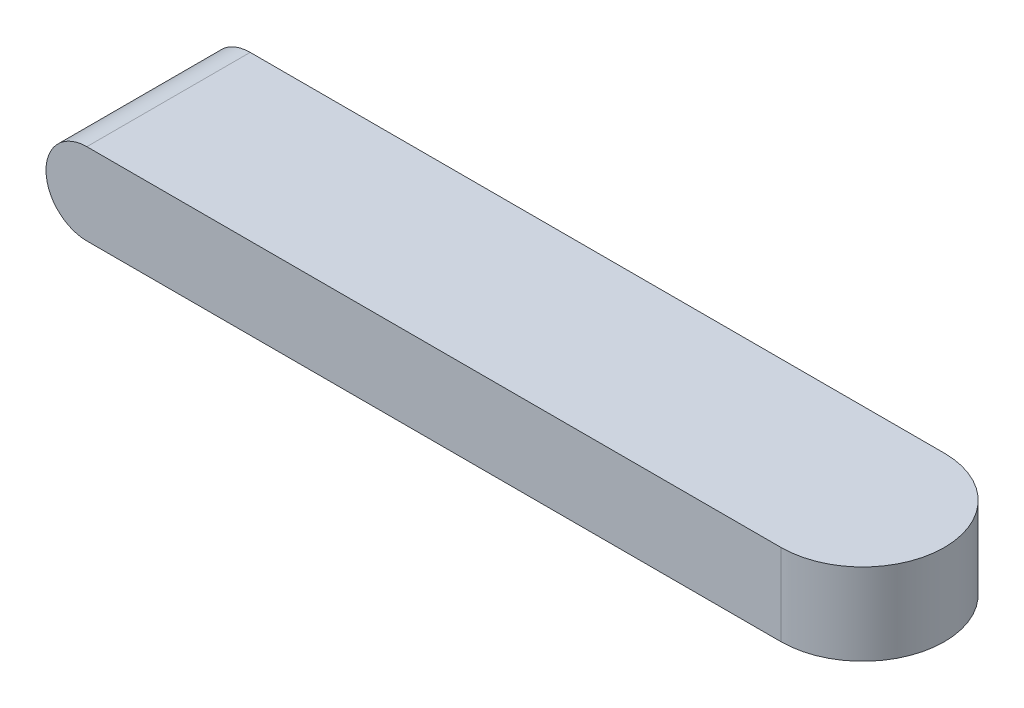
ISO-10303-21;
HEADER;
FILE_DESCRIPTION(('STEP AP214'),'2;1');
FILE_NAME('part.step','',(''),(''),'','','');
FILE_SCHEMA(('AUTOMOTIVE_DESIGN { 1 0 10303 214 1 1 1 1 }'));
ENDSEC;
DATA;
#1=APPLICATION_CONTEXT('core data for automotive mechanical design processes');
#2=APPLICATION_PROTOCOL_DEFINITION('international standard','automotive_design',2000,#1);
#3=PRODUCT_CONTEXT('',#1,'mechanical');
#4=PRODUCT('Part','Part','',(#3));
#5=PRODUCT_RELATED_PRODUCT_CATEGORY('part','',(#4));
#6=PRODUCT_DEFINITION_FORMATION('','',#4);
#7=PRODUCT_DEFINITION_CONTEXT('part definition',#1,'design');
#8=PRODUCT_DEFINITION('design','',#6,#7);
#9=PRODUCT_DEFINITION_SHAPE('','',#8);
#10=(LENGTH_UNIT() NAMED_UNIT(*) SI_UNIT(.MILLI.,.METRE.));
#11=(NAMED_UNIT(*) PLANE_ANGLE_UNIT() SI_UNIT($,.RADIAN.));
#12=(NAMED_UNIT(*) SI_UNIT($,.STERADIAN.) SOLID_ANGLE_UNIT());
#13=UNCERTAINTY_MEASURE_WITH_UNIT(LENGTH_MEASURE(1.E-05),#10,'distance_accuracy_value','');
#14=(GEOMETRIC_REPRESENTATION_CONTEXT(3) GLOBAL_UNCERTAINTY_ASSIGNED_CONTEXT((#13)) GLOBAL_UNIT_ASSIGNED_CONTEXT((#10,
#11,#12)) REPRESENTATION_CONTEXT('',''));
#15=CARTESIAN_POINT('',(0.,0.,0.));
#16=DIRECTION('',(0.,0.,1.));
#17=DIRECTION('',(1.,0.,0.));
#18=AXIS2_PLACEMENT_3D('',#15,#16,#17);
#19=CARTESIAN_POINT('',(-4.32587064676617,-0.226368159203982,0.));
#20=DIRECTION('',(0.,0.,-1.));
#21=DIRECTION('',(-1.,0.,0.));
#22=AXIS2_PLACEMENT_3D('',#19,#20,#21);
#23=CYLINDRICAL_SURFACE('',#22,0.5);
#24=DIRECTION('',(0.,0.,-1.));
#25=VECTOR('',#24,1.);
#26=CARTESIAN_POINT('',(-4.32587064676617,0.273631840796019,2.));
#27=LINE('',#26,#25);
#28=CARTESIAN_POINT('',(-4.32587064676617,0.273631840796019,0.));
#29=VERTEX_POINT('',#28);
#30=CARTESIAN_POINT('',(-4.32587064676617,0.273631840796019,2.));
#31=VERTEX_POINT('',#30);
#32=EDGE_CURVE('E97',#29,#31,#27,.F.);
#33=ORIENTED_EDGE('',*,*,#32,.F.);
#34=CARTESIAN_POINT('',(-4.32587064676617,-0.226368159203982,0.));
#35=DIRECTION('',(0.,0.,1.));
#36=DIRECTION('',(1.,0.,0.));
#37=AXIS2_PLACEMENT_3D('',#34,#35,#36);
#38=CIRCLE('',#37,0.5);
#39=CARTESIAN_POINT('',(-4.32587064676617,-0.726368159203982,0.));
#40=VERTEX_POINT('',#39);
#41=EDGE_CURVE('E39',#40,#29,#38,.F.);
#42=ORIENTED_EDGE('',*,*,#41,.F.);
#43=DIRECTION('',(0.,0.,-1.));
#44=VECTOR('',#43,1.);
#45=CARTESIAN_POINT('',(-4.32587064676617,-0.726368159203982,2.));
#46=LINE('',#45,#44);
#47=CARTESIAN_POINT('',(-4.32587064676617,-0.726368159203982,2.));
#48=VERTEX_POINT('',#47);
#49=EDGE_CURVE('E100',#48,#40,#46,.T.);
#50=ORIENTED_EDGE('',*,*,#49,.F.);
#51=CARTESIAN_POINT('',(-4.32587064676617,-0.226368159203982,2.));
#52=DIRECTION('',(0.,0.,1.));
#53=DIRECTION('',(1.,0.,0.));
#54=AXIS2_PLACEMENT_3D('',#51,#52,#53);
#55=CIRCLE('',#54,0.5);
#56=EDGE_CURVE('E11',#31,#48,#55,.T.);
#57=ORIENTED_EDGE('',*,*,#56,.F.);
#58=EDGE_LOOP('',(#33,#42,#50,#57));
#59=FACE_BOUND('',#58,.T.);
#60=ADVANCED_FACE('F32',(#59),#23,.T.);
#61=CARTESIAN_POINT('',(4.17412935323383,-0.726368159203981,1.));
#62=DIRECTION('',(0.,1.,0.));
#63=DIRECTION('',(0.,0.,1.));
#64=AXIS2_PLACEMENT_3D('',#61,#62,#63);
#65=CYLINDRICAL_SURFACE('',#64,1.);
#66=DIRECTION('',(0.,-1.,0.));
#67=VECTOR('',#66,1.);
#68=CARTESIAN_POINT('',(4.17412935323383,-0.726368159203981,2.));
#69=LINE('',#68,#67);
#70=CARTESIAN_POINT('',(4.17412935323383,-0.726368159203981,2.));
#71=VERTEX_POINT('',#70);
#72=CARTESIAN_POINT('',(4.17412935323383,0.273631840796019,2.));
#73=VERTEX_POINT('',#72);
#74=EDGE_CURVE('E72',#71,#73,#69,.F.);
#75=ORIENTED_EDGE('',*,*,#74,.F.);
#76=CARTESIAN_POINT('',(4.17412935323383,-0.726368159203981,1.));
#77=DIRECTION('',(0.,1.,0.));
#78=DIRECTION('',(-1.,0.,0.));
#79=AXIS2_PLACEMENT_3D('',#76,#77,#78);
#80=CIRCLE('',#79,1.);
#81=CARTESIAN_POINT('',(4.17412935323383,-0.726368159203981,0.));
#82=VERTEX_POINT('',#81);
#83=EDGE_CURVE('E79',#82,#71,#80,.F.);
#84=ORIENTED_EDGE('',*,*,#83,.F.);
#85=DIRECTION('',(0.,1.,0.));
#86=VECTOR('',#85,1.);
#87=CARTESIAN_POINT('',(4.17412935323383,0.,0.));
#88=LINE('',#87,#86);
#89=CARTESIAN_POINT('',(4.17412935323383,0.273631840796019,0.));
#90=VERTEX_POINT('',#89);
#91=EDGE_CURVE('E87',#90,#82,#88,.F.);
#92=ORIENTED_EDGE('',*,*,#91,.F.);
#93=CARTESIAN_POINT('',(4.17412935323383,0.273631840796019,1.));
#94=DIRECTION('',(0.,-1.,0.));
#95=DIRECTION('',(0.,0.,-1.));
#96=AXIS2_PLACEMENT_3D('',#93,#94,#95);
#97=CIRCLE('',#96,1.);
#98=EDGE_CURVE('E86',#73,#90,#97,.F.);
#99=ORIENTED_EDGE('',*,*,#98,.F.);
#100=EDGE_LOOP('',(#75,#84,#92,#99));
#101=FACE_BOUND('',#100,.T.);
#102=ADVANCED_FACE('F89',(#101),#65,.T.);
#103=CARTESIAN_POINT('',(5.17412935323383,-0.726368159203981,2.));
#104=DIRECTION('',(0.,1.,0.));
#105=DIRECTION('',(-1.,0.,0.));
#106=AXIS2_PLACEMENT_3D('',#103,#104,#105);
#107=PLANE('',#106);
#108=DIRECTION('',(1.,0.,0.));
#109=VECTOR('',#108,1.);
#110=CARTESIAN_POINT('',(5.17412935323383,-0.726368159203981,2.));
#111=LINE('',#110,#109);
#112=EDGE_CURVE('E68',#48,#71,#111,.T.);
#113=ORIENTED_EDGE('',*,*,#112,.F.);
#114=ORIENTED_EDGE('',*,*,#49,.T.);
#115=DIRECTION('',(1.,0.,0.));
#116=VECTOR('',#115,1.);
#117=CARTESIAN_POINT('',(5.17412935323383,-0.726368159203981,0.));
#118=LINE('',#117,#116);
#119=EDGE_CURVE('E82',#40,#82,#118,.T.);
#120=ORIENTED_EDGE('',*,*,#119,.T.);
#121=ORIENTED_EDGE('',*,*,#83,.T.);
#122=EDGE_LOOP('',(#113,#114,#120,#121));
#123=FACE_BOUND('',#122,.T.);
#124=ADVANCED_FACE('F80',(#123),#107,.F.);
#125=CARTESIAN_POINT('',(5.17412935323383,0.273631840796019,2.));
#126=DIRECTION('',(0.,-1.,0.));
#127=DIRECTION('',(0.,0.,-1.));
#128=AXIS2_PLACEMENT_3D('',#125,#126,#127);
#129=PLANE('',#128);
#130=DIRECTION('',(-1.,0.,0.));
#131=VECTOR('',#130,1.);
#132=CARTESIAN_POINT('',(5.17412935323383,0.273631840796019,0.));
#133=LINE('',#132,#131);
#134=EDGE_CURVE('E76',#90,#29,#133,.T.);
#135=ORIENTED_EDGE('',*,*,#134,.T.);
#136=ORIENTED_EDGE('',*,*,#32,.T.);
#137=DIRECTION('',(-1.,0.,0.));
#138=VECTOR('',#137,1.);
#139=CARTESIAN_POINT('',(5.17412935323383,0.273631840796019,2.));
#140=LINE('',#139,#138);
#141=EDGE_CURVE('E75',#73,#31,#140,.T.);
#142=ORIENTED_EDGE('',*,*,#141,.F.);
#143=ORIENTED_EDGE('',*,*,#98,.T.);
#144=EDGE_LOOP('',(#135,#136,#142,#143));
#145=FACE_BOUND('',#144,.T.);
#146=ADVANCED_FACE('F106',(#145),#129,.F.);
#147=CARTESIAN_POINT('',(0.,0.,2.));
#148=DIRECTION('',(0.,0.,1.));
#149=DIRECTION('',(1.,0.,0.));
#150=AXIS2_PLACEMENT_3D('',#147,#148,#149);
#151=PLANE('',#150);
#152=ORIENTED_EDGE('',*,*,#141,.T.);
#153=ORIENTED_EDGE('',*,*,#56,.T.);
#154=ORIENTED_EDGE('',*,*,#112,.T.);
#155=ORIENTED_EDGE('',*,*,#74,.T.);
#156=EDGE_LOOP('',(#152,#153,#154,#155));
#157=FACE_BOUND('',#156,.T.);
#158=ADVANCED_FACE('F70',(#157),#151,.T.);
#159=CARTESIAN_POINT('',(0.,0.,0.));
#160=DIRECTION('',(0.,0.,1.));
#161=DIRECTION('',(1.,0.,0.));
#162=AXIS2_PLACEMENT_3D('',#159,#160,#161);
#163=PLANE('',#162);
#164=ORIENTED_EDGE('',*,*,#119,.F.);
#165=ORIENTED_EDGE('',*,*,#41,.T.);
#166=ORIENTED_EDGE('',*,*,#134,.F.);
#167=ORIENTED_EDGE('',*,*,#91,.T.);
#168=EDGE_LOOP('',(#164,#165,#166,#167));
#169=FACE_BOUND('',#168,.T.);
#170=ADVANCED_FACE('F103',(#169),#163,.F.);
#171=CLOSED_SHELL('',(#60,#102,#124,#146,#158,#170));
#172=MANIFOLD_SOLID_BREP('B2',#171);
#173=ADVANCED_BREP_SHAPE_REPRESENTATION('',(#18,#172),#14);
#174=SHAPE_DEFINITION_REPRESENTATION(#9,#173);
ENDSEC;
END-ISO-10303-21;
